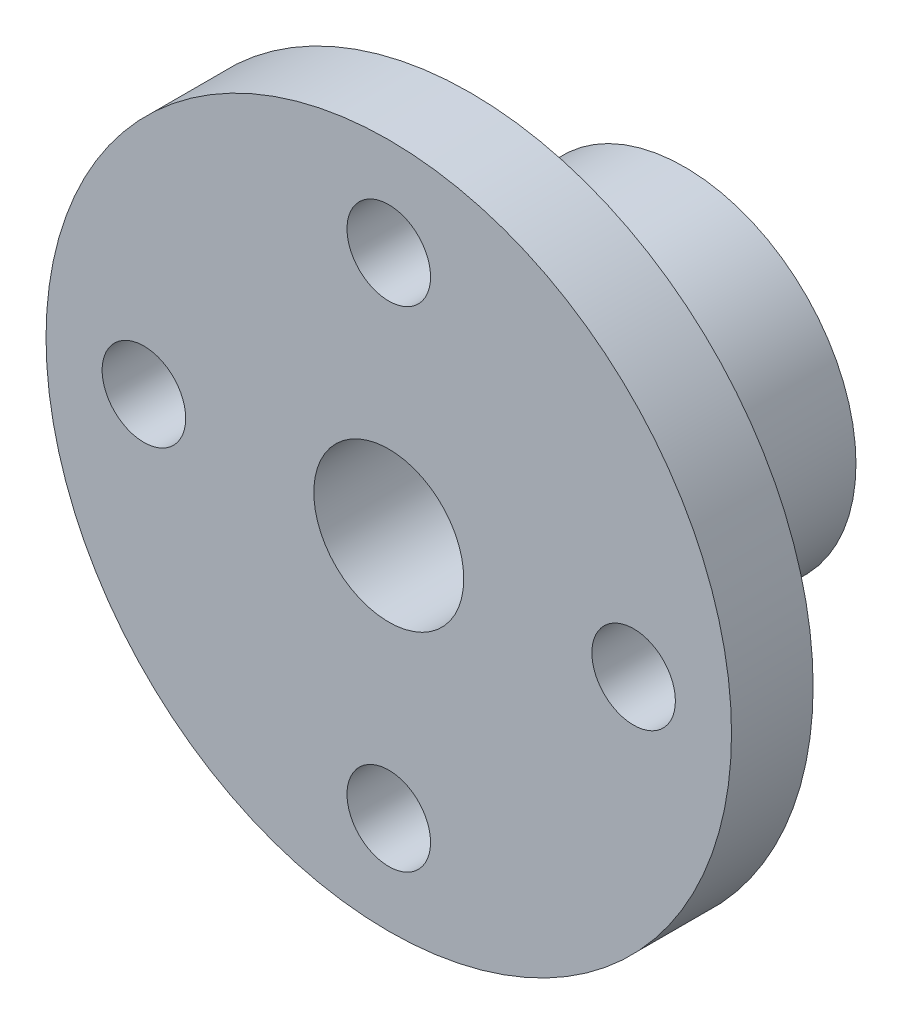
ISO-10303-21;
HEADER;
FILE_DESCRIPTION(('STEP AP214'),'2;1');
FILE_NAME('part.step','',(''),(''),'','','');
FILE_SCHEMA(('AUTOMOTIVE_DESIGN { 1 0 10303 214 1 1 1 1 }'));
ENDSEC;
DATA;
#1=APPLICATION_CONTEXT('core data for automotive mechanical design processes');
#2=APPLICATION_PROTOCOL_DEFINITION('international standard','automotive_design',2000,#1);
#3=PRODUCT_CONTEXT('',#1,'mechanical');
#4=PRODUCT('Part','Part','',(#3));
#5=PRODUCT_RELATED_PRODUCT_CATEGORY('part','',(#4));
#6=PRODUCT_DEFINITION_FORMATION('','',#4);
#7=PRODUCT_DEFINITION_CONTEXT('part definition',#1,'design');
#8=PRODUCT_DEFINITION('design','',#6,#7);
#9=PRODUCT_DEFINITION_SHAPE('','',#8);
#10=(LENGTH_UNIT() NAMED_UNIT(*) SI_UNIT(.MILLI.,.METRE.));
#11=(NAMED_UNIT(*) PLANE_ANGLE_UNIT() SI_UNIT($,.RADIAN.));
#12=(NAMED_UNIT(*) SI_UNIT($,.STERADIAN.) SOLID_ANGLE_UNIT());
#13=UNCERTAINTY_MEASURE_WITH_UNIT(LENGTH_MEASURE(1.E-05),#10,'distance_accuracy_value','');
#14=(GEOMETRIC_REPRESENTATION_CONTEXT(3) GLOBAL_UNCERTAINTY_ASSIGNED_CONTEXT((#13)) GLOBAL_UNIT_ASSIGNED_CONTEXT((#10,
#11,#12)) REPRESENTATION_CONTEXT('',''));
#15=CARTESIAN_POINT('',(0.,0.,0.));
#16=DIRECTION('',(0.,0.,1.));
#17=DIRECTION('',(1.,0.,0.));
#18=AXIS2_PLACEMENT_3D('',#15,#16,#17);
#19=CARTESIAN_POINT('',(0.,0.,0.));
#20=DIRECTION('',(0.,0.,1.));
#21=DIRECTION('',(1.,0.,0.));
#22=AXIS2_PLACEMENT_3D('',#19,#20,#21);
#23=PLANE('',#22);
#24=CARTESIAN_POINT('',(0.,0.,0.));
#25=DIRECTION('',(0.,0.,1.));
#26=DIRECTION('',(1.,0.,0.));
#27=AXIS2_PLACEMENT_3D('',#24,#25,#26);
#28=CIRCLE('',#27,8.);
#29=CARTESIAN_POINT('',(8.,0.,0.));
#30=VERTEX_POINT('',#29);
#31=EDGE_CURVE('E56',#30,#30,#28,.T.);
#32=ORIENTED_EDGE('',*,*,#31,.F.);
#33=EDGE_LOOP('',(#32));
#34=FACE_BOUND('',#33,.T.);
#35=CARTESIAN_POINT('',(0.,0.,0.));
#36=DIRECTION('',(0.,0.,1.));
#37=DIRECTION('',(1.,0.,0.));
#38=AXIS2_PLACEMENT_3D('',#35,#36,#37);
#39=CIRCLE('',#38,3.5);
#40=CARTESIAN_POINT('',(3.5,0.,0.));
#41=VERTEX_POINT('',#40);
#42=EDGE_CURVE('E62',#41,#41,#39,.T.);
#43=ORIENTED_EDGE('',*,*,#42,.T.);
#44=EDGE_LOOP('',(#43));
#45=FACE_BOUND('',#44,.T.);
#46=ADVANCED_FACE('F41',(#34,#45),#23,.F.);
#47=CARTESIAN_POINT('',(0.,0.,10.));
#48=DIRECTION('',(0.,0.,-1.));
#49=DIRECTION('',(-1.,0.,0.));
#50=AXIS2_PLACEMENT_3D('',#47,#48,#49);
#51=CYLINDRICAL_SURFACE('',#50,8.);
#52=CARTESIAN_POINT('',(0.,-8.,7.));
#53=CARTESIAN_POINT('',(0.110501451559641,-7.9999981315735,6.99999689901579));
#54=CARTESIAN_POINT('',(0.221037543774351,-7.99768770842435,6.99081126563495));
#55=CARTESIAN_POINT('',(0.438941765027377,-7.98869485106526,6.95436646492399));
#56=CARTESIAN_POINT('',(0.546308062494319,-7.98200993893301,6.92709705394953));
#57=CARTESIAN_POINT('',(0.754694496243435,-7.96500835109376,6.85541432871722));
#58=CARTESIAN_POINT('',(0.855722084573335,-7.95469603789411,6.81102160171297));
#59=CARTESIAN_POINT('',(1.04889617587257,-7.93153791743495,6.70642481327354));
#60=CARTESIAN_POINT('',(1.14104237913168,-7.91869202472209,6.64622021850804));
#61=CARTESIAN_POINT('',(1.31573590306789,-7.89156551455591,6.51039894712776));
#62=CARTESIAN_POINT('',(1.39807425341474,-7.87726276197502,6.43451790005459));
#63=CARTESIAN_POINT('',(1.54899856960443,-7.84898160157248,6.27006372678795));
#64=CARTESIAN_POINT('',(1.61758298259892,-7.83500323053157,6.18148916940409));
#65=CARTESIAN_POINT('',(1.74003539039863,-7.80873034264225,5.99253969768401));
#66=CARTESIAN_POINT('',(1.79366962123352,-7.79646392619748,5.89200902558836));
#67=CARTESIAN_POINT('',(1.88319587806766,-7.77532659757355,5.68300211778662));
#68=CARTESIAN_POINT('',(1.91909074058685,-7.76645514259225,5.57452715555731));
#69=CARTESIAN_POINT('',(1.97140644907302,-7.7533396892843,5.35500866906445));
#70=CARTESIAN_POINT('',(1.98820302444274,-7.74900654662681,5.24406013861601));
#71=CARTESIAN_POINT('',(2.00301570008854,-7.74519149946122,5.02084190800087));
#72=CARTESIAN_POINT('',(2.00103485575748,-7.74570880570571,4.90857242574382));
#73=CARTESIAN_POINT('',(1.97864869951961,-7.75145607355756,4.6887789230062));
#74=CARTESIAN_POINT('',(1.95869112025418,-7.75657150676391,4.58120583804623));
#75=CARTESIAN_POINT('',(1.90163224920399,-7.77075612894758,4.37098526545192));
#76=CARTESIAN_POINT('',(1.86452973609252,-7.77982559958985,4.26833812929477));
#77=CARTESIAN_POINT('',(1.77385263724958,-7.80100151874212,4.06968264499716));
#78=CARTESIAN_POINT('',(1.72011555631056,-7.81313769959755,3.97375177094724));
#79=CARTESIAN_POINT('',(1.59780836801993,-7.83906281127988,3.79210838699091));
#80=CARTESIAN_POINT('',(1.52923566507845,-7.85285203112837,3.70639766924367));
#81=CARTESIAN_POINT('',(1.37688456624163,-7.88101174053188,3.54506184574079));
#82=CARTESIAN_POINT('',(1.29272834422115,-7.89538759304001,3.46979401325153));
#83=CARTESIAN_POINT('',(1.11281589000493,-7.92274620771675,3.3343716767148));
#84=CARTESIAN_POINT('',(1.01705930361059,-7.93572892732543,3.27421763431525));
#85=CARTESIAN_POINT('',(0.816154518241856,-7.9589030945892,3.17059921836749));
#86=CARTESIAN_POINT('',(0.710975190944832,-7.96908480170303,3.12719287966076));
#87=CARTESIAN_POINT('',(0.494501344190511,-7.98543889321888,3.05877692572057));
#88=CARTESIAN_POINT('',(0.383207998867313,-7.99161204452374,3.03376379144248));
#89=CARTESIAN_POINT('',(0.160719960520036,-7.999139990285,3.00338991258822));
#90=CARTESIAN_POINT('',(0.0495956266509472,-8.00061404677705,2.9975426318996));
#91=CARTESIAN_POINT('',(-0.172043833068677,-7.99891739752601,3.00433200274065));
#92=CARTESIAN_POINT('',(-0.282559012859459,-7.99574710989128,3.01696699039884));
#93=CARTESIAN_POINT('',(-0.498152358368655,-7.98519441503143,3.05996121118851));
#94=CARTESIAN_POINT('',(-0.603286825291672,-7.97787512247748,3.09005501796932));
#95=CARTESIAN_POINT('',(-0.807009723270015,-7.95984942178845,3.16680944537126));
#96=CARTESIAN_POINT('',(-0.905597492043513,-7.94914267159856,3.21347173908423));
#97=CARTESIAN_POINT('',(-1.0953641792398,-7.92524410568414,3.3229815051663));
#98=CARTESIAN_POINT('',(-1.18638058911444,-7.91201156489243,3.38610148319568));
#99=CARTESIAN_POINT('',(-1.35670215152433,-7.88459345583226,3.52638654506263));
#100=CARTESIAN_POINT('',(-1.43600527863068,-7.87040772335606,3.60355405282254));
#101=CARTESIAN_POINT('',(-1.58265409076364,-7.84225275947695,3.77200261445929));
#102=CARTESIAN_POINT('',(-1.64965849016271,-7.82829738916375,3.86358360400323));
#103=CARTESIAN_POINT('',(-1.7673476786836,-7.80257171169652,4.05697684595429));
#104=CARTESIAN_POINT('',(-1.81803319221058,-7.79080130756035,4.15878864394634));
#105=CARTESIAN_POINT('',(-1.90126856081239,-7.77090792979554,4.3692076298841));
#106=CARTESIAN_POINT('',(-1.93392586220542,-7.76276340389208,4.47777017112535));
#107=CARTESIAN_POINT('',(-1.98046087993837,-7.75102325453578,4.69907951718548));
#108=CARTESIAN_POINT('',(-1.99434270330488,-7.74742663626581,4.81182540137665));
#109=CARTESIAN_POINT('',(-2.00271812044533,-7.74526534938609,5.03482803180694));
#110=CARTESIAN_POINT('',(-1.99775719704016,-7.74655910304351,5.14506324683297));
#111=CARTESIAN_POINT('',(-1.96983637108382,-7.7537054534379,5.36307185155731));
#112=CARTESIAN_POINT('',(-1.94687683024903,-7.75955795855809,5.47084529068487));
#113=CARTESIAN_POINT('',(-1.88390842592373,-7.77508347576963,5.68027794542054));
#114=CARTESIAN_POINT('',(-1.84400187290717,-7.78473353648412,5.78196974032028));
#115=CARTESIAN_POINT('',(-1.74835321814009,-7.80677007633105,5.97728717695158));
#116=CARTESIAN_POINT('',(-1.69260892004558,-7.81915693494364,6.07091169758255));
#117=CARTESIAN_POINT('',(-1.56515699818285,-7.84567512351349,6.25007283866936));
#118=CARTESIAN_POINT('',(-1.49307088388301,-7.85984353109009,6.33533476456528));
#119=CARTESIAN_POINT('',(-1.33571916158631,-7.88810702995047,6.49272939306054));
#120=CARTESIAN_POINT('',(-1.25045042834819,-7.90220210302746,6.56485897348396));
#121=CARTESIAN_POINT('',(-1.06729011560345,-7.92903540863551,6.69521507808614));
#122=CARTESIAN_POINT('',(-0.969197896421848,-7.94174444487824,6.75316615156211));
#123=CARTESIAN_POINT('',(-0.764354746013968,-7.96406566633491,6.85166328392071));
#124=CARTESIAN_POINT('',(-0.657610084582319,-7.97368006933042,6.89222181419805));
#125=CARTESIAN_POINT('',(-0.459213670991295,-7.98730746087389,6.94876244043954));
#126=CARTESIAN_POINT('',(-0.368506894544091,-7.9920344673692,6.96793499073791));
#127=CARTESIAN_POINT('',(-0.18520809538171,-7.99838140309264,6.99355459149592));
#128=CARTESIAN_POINT('',(-0.0926162149901548,-8.00000156601192,7.00000259907373));
#129=CARTESIAN_POINT('',(0.,-8.,7.));
#130=B_SPLINE_CURVE_WITH_KNOTS('',3,(#52,#53,#54,#55,#56,#57,#58,#59,#60,#61,#62,#63,#64,#65,
#66,#67,#68,#69,#70,#71,#72,#73,#74,#75,#76,#77,#78,#79,#80,#81,#82,#83,#84,#85,#86,#87,#88,#89,
#90,#91,#92,#93,#94,#95,#96,#97,#98,#99,#100,#101,#102,#103,#104,#105,#106,#107,#108,#109,#110,
#111,#112,#113,#114,#115,#116,#117,#118,#119,#120,#121,#122,#123,#124,#125,#126,#127,#128,#129),
.UNSPECIFIED.,.T.,.F.,(4,2,2,2,2,2,2,2,2,2,2,2,2,2,2,2,2,2,2,2,2,2,2,2,2,2,2,2,2,2,2,2,2,2,2,2,
2,2,4),(0.,0.331164949962519,0.662517650351866,0.99347320304814,1.32443992022577,
1.66152580582852,1.99864972773416,2.34078196727742,2.68285948225824,3.01808393468093,
3.3532538415469,3.68029996013785,4.00736937959145,4.337740371696,4.66816921119311,
5.00802001296453,5.34788119415424,5.6889097201658,6.02987298255951,6.36211078603462,
6.69431868154751,7.02160366023144,7.34892169767481,7.68204783424897,8.01523150681786,
8.35659345610395,8.69794025003772,9.03723006156476,9.37644564340971,9.70591707202578,
10.0353818794581,10.3628853408369,10.6904342418696,11.0265276855097,11.3627009303165,
11.7049624733721,12.0469781843289,12.3245632392729,12.6021274139515),.UNSPECIFIED.);
#131=CARTESIAN_POINT('',(0.,-8.,7.));
#132=VERTEX_POINT('',#131);
#133=EDGE_CURVE('E243',#132,#132,#130,.T.);
#134=ORIENTED_EDGE('',*,*,#133,.T.);
#135=EDGE_LOOP('',(#134));
#136=FACE_BOUND('',#135,.T.);
#137=CARTESIAN_POINT('',(0.,0.,10.));
#138=DIRECTION('',(0.,0.,1.));
#139=DIRECTION('',(1.,0.,0.));
#140=AXIS2_PLACEMENT_3D('',#137,#138,#139);
#141=CIRCLE('',#140,8.);
#142=CARTESIAN_POINT('',(8.,0.,10.));
#143=VERTEX_POINT('',#142);
#144=EDGE_CURVE('E10',#143,#143,#141,.T.);
#145=ORIENTED_EDGE('',*,*,#144,.F.);
#146=EDGE_LOOP('',(#145));
#147=FACE_BOUND('',#146,.T.);
#148=ORIENTED_EDGE('',*,*,#31,.T.);
#149=EDGE_LOOP('',(#148));
#150=FACE_BOUND('',#149,.T.);
#151=ADVANCED_FACE('F43',(#136,#147,#150),#51,.T.);
#152=CARTESIAN_POINT('',(0.,0.,10.));
#153=DIRECTION('',(0.,0.,-1.));
#154=DIRECTION('',(-1.,0.,0.));
#155=AXIS2_PLACEMENT_3D('',#152,#153,#154);
#156=CYLINDRICAL_SURFACE('',#155,3.5);
#157=CARTESIAN_POINT('',(0.,-3.5,7.));
#158=CARTESIAN_POINT('',(0.103121073276095,-3.49999553497163,6.99999502725213));
#159=CARTESIAN_POINT('',(0.206418292241573,-3.49539218804252,6.99196945368553));
#160=CARTESIAN_POINT('',(0.409938220573779,-3.47741964792396,6.96025838229543));
#161=CARTESIAN_POINT('',(0.510152306170788,-3.46402785992758,6.93653251819956));
#162=CARTESIAN_POINT('',(0.704136692781992,-3.42984640883029,6.87470120206554));
#163=CARTESIAN_POINT('',(0.79793516993675,-3.40909195395481,6.83666413455008));
#164=CARTESIAN_POINT('',(0.977566018148809,-3.36199330055898,6.74769013430304));
#165=CARTESIAN_POINT('',(1.06340059975113,-3.33565065986803,6.69675679592544));
#166=CARTESIAN_POINT('',(1.23168334606477,-3.27741428654611,6.57931420254712));
#167=CARTESIAN_POINT('',(1.31343890348909,-3.24525701136939,6.51194552690006));
#168=CARTESIAN_POINT('',(1.46516457042854,-3.17964476042357,6.36544265813628));
#169=CARTESIAN_POINT('',(1.53512065191323,-3.1461882973923,6.28629466837634));
#170=CARTESIAN_POINT('',(1.66894420512512,-3.07747838735578,6.10830358077026));
#171=CARTESIAN_POINT('',(1.73132377325174,-3.04242478885631,6.00825487214969));
#172=CARTESIAN_POINT('',(1.83811251873574,-2.9791301999857,5.79704972790448));
#173=CARTESIAN_POINT('',(1.88254890095162,-2.9508789226201,5.68591042899068));
#174=CARTESIAN_POINT('',(1.94359344806483,-2.9109223878371,5.48085483564781));
#175=CARTESIAN_POINT('',(1.96418339921187,-2.89693925602986,5.38856848582508));
#176=CARTESIAN_POINT('',(1.99210676207498,-2.87781339076578,5.20115026430666));
#177=CARTESIAN_POINT('',(1.99945438414142,-2.87266118113285,5.10602155436301));
#178=CARTESIAN_POINT('',(2.00048758468052,-2.87194187276704,4.91552531469126));
#179=CARTESIAN_POINT('',(1.99415450528781,-2.87638786414303,4.82015763621347));
#180=CARTESIAN_POINT('',(1.96816496378147,-2.89422946937727,4.63209749481326));
#181=CARTESIAN_POINT('',(1.94849933463808,-2.90763124084925,4.53940691832707));
#182=CARTESIAN_POINT('',(1.8969175277205,-2.94153701353578,4.35933506968057));
#183=CARTESIAN_POINT('',(1.86504898450024,-2.9620133688412,4.27193466450099));
#184=CARTESIAN_POINT('',(1.79016995537344,-3.00785886649625,4.10345014732228));
#185=CARTESIAN_POINT('',(1.74715520649775,-3.03322987990244,4.02236846744482));
#186=CARTESIAN_POINT('',(1.64323768381765,-3.09092813712121,3.8550271046303));
#187=CARTESIAN_POINT('',(1.5805729697491,-3.12371858601075,3.77001985827188));
#188=CARTESIAN_POINT('',(1.44275323922578,-3.18971935679179,3.61091568049858));
#189=CARTESIAN_POINT('',(1.3675875758611,-3.22293001410094,3.53682815160806));
#190=CARTESIAN_POINT('',(1.19664071603844,-3.29050445602272,3.39317579858664));
#191=CARTESIAN_POINT('',(1.0994865853507,-3.32456879734034,3.32508704888204));
#192=CARTESIAN_POINT('',(0.893015490655647,-3.38586602556589,3.20649320854487));
#193=CARTESIAN_POINT('',(0.783706249477136,-3.41310321475137,3.1559770363486));
#194=CARTESIAN_POINT('',(0.56379377817917,-3.45598032097163,3.07781607577408));
#195=CARTESIAN_POINT('',(0.453802193453647,-3.47229170031822,3.04883178938481));
#196=CARTESIAN_POINT('',(0.229493069556977,-3.49427902499676,3.00996184112122));
#197=CARTESIAN_POINT('',(0.115179910205494,-3.49996545850225,3.0000573447666));
#198=CARTESIAN_POINT('',(-0.099523459313444,-3.50003013582766,2.99994998886615));
#199=CARTESIAN_POINT('',(-0.199920938989512,-3.49569611836472,3.00750353381573));
#200=CARTESIAN_POINT('',(-0.39775495897108,-3.47874174583056,3.03740057339513));
#201=CARTESIAN_POINT('',(-0.495191448486275,-3.46612124870397,3.05974432157391));
#202=CARTESIAN_POINT('',(-0.683570804723374,-3.43391644887745,3.11788463846708));
#203=CARTESIAN_POINT('',(-0.774570013012139,-3.41440488141579,3.15354090994096));
#204=CARTESIAN_POINT('',(-0.949355356164682,-3.36999496877882,3.23701573604713));
#205=CARTESIAN_POINT('',(-1.03313974782513,-3.34509532684397,3.28483721899456));
#206=CARTESIAN_POINT('',(-1.20050997117732,-3.28897467991618,3.39689384085787));
#207=CARTESIAN_POINT('',(-1.28316737085611,-3.25736546620182,3.4623193381627));
#208=CARTESIAN_POINT('',(-1.43697220197863,-3.19250590835506,3.6049616611228));
#209=CARTESIAN_POINT('',(-1.50810627029584,-3.15925371640031,3.68219197754095));
#210=CARTESIAN_POINT('',(-1.64492727997191,-3.09042173562361,3.85640252380876));
#211=CARTESIAN_POINT('',(-1.70912186715334,-3.05499597284182,3.9546247985922));
#212=CARTESIAN_POINT('',(-1.8199337629672,-2.99031347421968,4.16235463141538));
#213=CARTESIAN_POINT('',(-1.86657443137411,-2.96104856289278,4.27184694289746));
#214=CARTESIAN_POINT('',(-1.93222109228879,-2.91851233429598,4.4752352640087));
#215=CARTESIAN_POINT('',(-1.95499953445203,-2.90316105554951,4.56747649103178));
#216=CARTESIAN_POINT('',(-1.98724336712396,-2.88119032331328,4.75523409234326));
#217=CARTESIAN_POINT('',(-1.99672390601701,-2.87456093476639,4.85074661279577));
#218=CARTESIAN_POINT('',(-2.00185191685029,-2.87099312033822,5.04252276986693));
#219=CARTESIAN_POINT('',(-1.99747153858607,-2.87407420528575,5.13878753054577));
#220=CARTESIAN_POINT('',(-1.97508383758896,-2.8895014010665,5.32897715069236));
#221=CARTESIAN_POINT('',(-1.95706789608754,-2.90185337180125,5.42290049139406));
#222=CARTESIAN_POINT('',(-1.90877044170586,-2.93383807739165,5.60437563303356));
#223=CARTESIAN_POINT('',(-1.87870654392502,-2.95334114102881,5.69200955824919));
#224=CARTESIAN_POINT('',(-1.8074218972167,-2.99749553285303,5.86119909574359));
#225=CARTESIAN_POINT('',(-1.7661970341072,-3.02214875873851,5.94275245242157));
#226=CARTESIAN_POINT('',(-1.66643167949608,-3.07843523089261,6.11084333294311));
#227=CARTESIAN_POINT('',(-1.60620233461966,-3.11055873295866,6.19621458045877));
#228=CARTESIAN_POINT('',(-1.47338604433882,-3.17562734730331,6.35645763372194));
#229=CARTESIAN_POINT('',(-1.40078837818174,-3.20857315102009,6.43132022710409));
#230=CARTESIAN_POINT('',(-1.23454792336607,-3.27641810201075,6.57786072312091));
#231=CARTESIAN_POINT('',(-1.13941038595581,-3.31104995544659,6.64798238220285));
#232=CARTESIAN_POINT('',(-0.93668149876144,-3.37399623220539,6.77105878863118));
#233=CARTESIAN_POINT('',(-0.829097167751355,-3.4023141898287,6.82402314759852));
#234=CARTESIAN_POINT('',(-0.62438250119415,-3.44515268687731,6.90261714413287));
#235=CARTESIAN_POINT('',(-0.528793868969384,-3.46123111271098,6.93143235098222));
#236=CARTESIAN_POINT('',(-0.333572465521446,-3.48544612424225,6.97450218307986));
#237=CARTESIAN_POINT('',(-0.233952251382032,-3.49360564902775,6.98879887048321));
#238=CARTESIAN_POINT('',(-0.111553482810458,-3.49829363663156,6.99701217642184));
#239=CARTESIAN_POINT('',(-0.0892655426398963,-3.49893257713488,6.99813153012492));
#240=CARTESIAN_POINT('',(-0.0446544907868009,-3.49978626453079,6.99962601938614));
#241=CARTESIAN_POINT('',(-0.0223313756604228,-3.50000096692386,7.00000107687301));
#242=CARTESIAN_POINT('',(0.,-3.5,7.));
#243=B_SPLINE_CURVE_WITH_KNOTS('',3,(#157,#158,#159,#160,#161,#162,#163,#164,#165,#166,#167,
#168,#169,#170,#171,#172,#173,#174,#175,#176,#177,#178,#179,#180,#181,#182,#183,#184,#185,#186,
#187,#188,#189,#190,#191,#192,#193,#194,#195,#196,#197,#198,#199,#200,#201,#202,#203,#204,#205,
#206,#207,#208,#209,#210,#211,#212,#213,#214,#215,#216,#217,#218,#219,#220,#221,#222,#223,#224,
#225,#226,#227,#228,#229,#230,#231,#232,#233,#234,#235,#236,#237,#238,#239,#240,#241,#242),
.UNSPECIFIED.,.T.,.F.,(4,2,2,2,2,2,2,2,2,2,2,2,2,2,2,2,2,2,2,2,2,2,2,2,2,2,2,2,2,2,2,2,2,2,2,2,
2,2,2,2,2,2,4),(0.,0.309268603260588,0.619335457908361,0.9279391304917,1.23645688582088,
1.56726264134176,1.89845895106408,2.2656484043951,2.63227902790326,2.91779157032785,
3.2029975462506,3.48859273422686,3.77438448762791,4.05907183070886,4.34386821620899,
4.67430361887065,5.00502190433096,5.37340568410987,5.74155673192308,6.08426181113763,
6.42662841774189,6.72747548140297,7.028327702629,7.32609492686909,7.62393389525626,
7.95277463151787,8.28199402221959,8.64793130772769,9.01337988790352,9.30087929443284,
9.58805092761004,9.87579992974731,10.1637309643623,10.4466801504154,10.7297337802306,
11.0563737137124,11.3832982298872,11.7509152703937,12.1183260120783,12.4204193511693,
12.7216349655948,12.7886015789519,12.85557521625),.UNSPECIFIED.);
#244=CARTESIAN_POINT('',(0.,-3.5,7.));
#245=VERTEX_POINT('',#244);
#246=EDGE_CURVE('E46',#245,#245,#243,.T.);
#247=ORIENTED_EDGE('',*,*,#246,.F.);
#248=EDGE_LOOP('',(#247));
#249=FACE_BOUND('',#248,.T.);
#250=ORIENTED_EDGE('',*,*,#42,.F.);
#251=EDGE_LOOP('',(#250));
#252=FACE_BOUND('',#251,.T.);
#253=CARTESIAN_POINT('',(0.,0.,13.81));
#254=DIRECTION('',(0.,0.,1.));
#255=DIRECTION('',(1.,0.,0.));
#256=AXIS2_PLACEMENT_3D('',#253,#254,#255);
#257=CIRCLE('',#256,3.5);
#258=CARTESIAN_POINT('',(3.5,0.,13.81));
#259=VERTEX_POINT('',#258);
#260=EDGE_CURVE('E82',#259,#259,#257,.T.);
#261=ORIENTED_EDGE('',*,*,#260,.T.);
#262=EDGE_LOOP('',(#261));
#263=FACE_BOUND('',#262,.T.);
#264=ADVANCED_FACE('F107',(#249,#252,#263),#156,.F.);
#265=CARTESIAN_POINT('',(0.,0.,13.81));
#266=DIRECTION('',(0.,0.,1.));
#267=DIRECTION('',(1.,0.,0.));
#268=AXIS2_PLACEMENT_3D('',#265,#266,#267);
#269=PLANE('',#268);
#270=CARTESIAN_POINT('',(0.,11.43,13.81));
#271=DIRECTION('',(0.,0.,1.));
#272=DIRECTION('',(1.,0.,0.));
#273=AXIS2_PLACEMENT_3D('',#270,#271,#272);
#274=CIRCLE('',#273,1.95);
#275=CARTESIAN_POINT('',(1.95,11.43,13.81));
#276=VERTEX_POINT('',#275);
#277=EDGE_CURVE('E72',#276,#276,#274,.T.);
#278=ORIENTED_EDGE('',*,*,#277,.F.);
#279=EDGE_LOOP('',(#278));
#280=FACE_BOUND('',#279,.T.);
#281=CARTESIAN_POINT('',(11.4300000000003,2.8697597116275E-13,13.81));
#282=DIRECTION('',(0.,0.,1.));
#283=DIRECTION('',(1.,0.,0.));
#284=AXIS2_PLACEMENT_3D('',#281,#282,#283);
#285=CIRCLE('',#284,1.95);
#286=CARTESIAN_POINT('',(13.3800000000003,2.8697597116275E-13,13.81));
#287=VERTEX_POINT('',#286);
#288=EDGE_CURVE('E253',#287,#287,#285,.T.);
#289=ORIENTED_EDGE('',*,*,#288,.F.);
#290=EDGE_LOOP('',(#289));
#291=FACE_BOUND('',#290,.T.);
#292=CARTESIAN_POINT('',(5.739519423255E-13,-11.43,13.81));
#293=DIRECTION('',(0.,0.,1.));
#294=DIRECTION('',(1.,0.,0.));
#295=AXIS2_PLACEMENT_3D('',#292,#293,#294);
#296=CIRCLE('',#295,1.95);
#297=CARTESIAN_POINT('',(1.95000000000057,-11.43,13.81));
#298=VERTEX_POINT('',#297);
#299=EDGE_CURVE('E256',#298,#298,#296,.T.);
#300=ORIENTED_EDGE('',*,*,#299,.F.);
#301=EDGE_LOOP('',(#300));
#302=FACE_BOUND('',#301,.T.);
#303=CARTESIAN_POINT('',(-11.4299999999997,-2.88375742454175E-13,13.81));
#304=DIRECTION('',(0.,0.,1.));
#305=DIRECTION('',(1.,0.,0.));
#306=AXIS2_PLACEMENT_3D('',#303,#304,#305);
#307=CIRCLE('',#306,1.95);
#308=CARTESIAN_POINT('',(-9.47999999999971,-2.88375742454175E-13,13.81));
#309=VERTEX_POINT('',#308);
#310=EDGE_CURVE('E96',#309,#309,#307,.T.);
#311=ORIENTED_EDGE('',*,*,#310,.F.);
#312=EDGE_LOOP('',(#311));
#313=FACE_BOUND('',#312,.T.);
#314=CARTESIAN_POINT('',(0.,0.,13.81));
#315=DIRECTION('',(0.,0.,1.));
#316=DIRECTION('',(1.,0.,0.));
#317=AXIS2_PLACEMENT_3D('',#314,#315,#316);
#318=CIRCLE('',#317,16.);
#319=CARTESIAN_POINT('',(-16.,0.,13.81));
#320=VERTEX_POINT('',#319);
#321=EDGE_CURVE('E93',#320,#320,#318,.T.);
#322=ORIENTED_EDGE('',*,*,#321,.T.);
#323=EDGE_LOOP('',(#322));
#324=FACE_BOUND('',#323,.T.);
#325=ORIENTED_EDGE('',*,*,#260,.F.);
#326=EDGE_LOOP('',(#325));
#327=FACE_BOUND('',#326,.T.);
#328=ADVANCED_FACE('F109',(#280,#291,#302,#313,#324,#327),#269,.T.);
#329=CARTESIAN_POINT('',(0.,0.,10.));
#330=DIRECTION('',(0.,0.,1.));
#331=DIRECTION('',(1.,0.,0.));
#332=AXIS2_PLACEMENT_3D('',#329,#330,#331);
#333=PLANE('',#332);
#334=CARTESIAN_POINT('',(0.,11.43,10.));
#335=DIRECTION('',(0.,0.,1.));
#336=DIRECTION('',(1.,0.,0.));
#337=AXIS2_PLACEMENT_3D('',#334,#335,#336);
#338=CIRCLE('',#337,1.95);
#339=CARTESIAN_POINT('',(1.95,11.43,10.));
#340=VERTEX_POINT('',#339);
#341=EDGE_CURVE('E79',#340,#340,#338,.T.);
#342=ORIENTED_EDGE('',*,*,#341,.T.);
#343=EDGE_LOOP('',(#342));
#344=FACE_BOUND('',#343,.T.);
#345=CARTESIAN_POINT('',(11.4300000000003,2.8697597116275E-13,10.));
#346=DIRECTION('',(0.,0.,1.));
#347=DIRECTION('',(1.,0.,0.));
#348=AXIS2_PLACEMENT_3D('',#345,#346,#347);
#349=CIRCLE('',#348,1.95);
#350=CARTESIAN_POINT('',(13.3800000000003,2.8697597116275E-13,10.));
#351=VERTEX_POINT('',#350);
#352=EDGE_CURVE('E76',#351,#351,#349,.T.);
#353=ORIENTED_EDGE('',*,*,#352,.T.);
#354=EDGE_LOOP('',(#353));
#355=FACE_BOUND('',#354,.T.);
#356=CARTESIAN_POINT('',(5.739519423255E-13,-11.43,10.));
#357=DIRECTION('',(0.,0.,1.));
#358=DIRECTION('',(1.,0.,0.));
#359=AXIS2_PLACEMENT_3D('',#356,#357,#358);
#360=CIRCLE('',#359,1.95);
#361=CARTESIAN_POINT('',(1.95000000000057,-11.43,10.));
#362=VERTEX_POINT('',#361);
#363=EDGE_CURVE('E71',#362,#362,#360,.T.);
#364=ORIENTED_EDGE('',*,*,#363,.T.);
#365=EDGE_LOOP('',(#364));
#366=FACE_BOUND('',#365,.T.);
#367=CARTESIAN_POINT('',(-11.4299999999997,-2.88375742454175E-13,10.));
#368=DIRECTION('',(0.,0.,1.));
#369=DIRECTION('',(1.,0.,0.));
#370=AXIS2_PLACEMENT_3D('',#367,#368,#369);
#371=CIRCLE('',#370,1.95);
#372=CARTESIAN_POINT('',(-9.47999999999971,-2.88375742454175E-13,10.));
#373=VERTEX_POINT('',#372);
#374=EDGE_CURVE('E67',#373,#373,#371,.T.);
#375=ORIENTED_EDGE('',*,*,#374,.T.);
#376=EDGE_LOOP('',(#375));
#377=FACE_BOUND('',#376,.T.);
#378=ORIENTED_EDGE('',*,*,#144,.T.);
#379=EDGE_LOOP('',(#378));
#380=FACE_BOUND('',#379,.T.);
#381=CARTESIAN_POINT('',(0.,0.,10.));
#382=DIRECTION('',(0.,0.,1.));
#383=DIRECTION('',(1.,0.,0.));
#384=AXIS2_PLACEMENT_3D('',#381,#382,#383);
#385=CIRCLE('',#384,16.);
#386=CARTESIAN_POINT('',(-16.,0.,10.));
#387=VERTEX_POINT('',#386);
#388=EDGE_CURVE('E87',#387,#387,#385,.T.);
#389=ORIENTED_EDGE('',*,*,#388,.F.);
#390=EDGE_LOOP('',(#389));
#391=FACE_BOUND('',#390,.T.);
#392=ADVANCED_FACE('F115',(#344,#355,#366,#377,#380,#391),#333,.F.);
#393=CARTESIAN_POINT('',(0.,0.,13.81));
#394=DIRECTION('',(0.,0.,-1.));
#395=DIRECTION('',(-1.,0.,0.));
#396=AXIS2_PLACEMENT_3D('',#393,#394,#395);
#397=CYLINDRICAL_SURFACE('',#396,16.);
#398=CARTESIAN_POINT('',(-16.,0.,13.81));
#399=CARTESIAN_POINT('',(-16.,0.,13.7703125));
#400=CARTESIAN_POINT('',(-16.,0.,13.730625));
#401=CARTESIAN_POINT('',(-16.,0.,13.65125));
#402=CARTESIAN_POINT('',(-16.,0.,13.6115625));
#403=CARTESIAN_POINT('',(-16.,0.,13.5321875));
#404=CARTESIAN_POINT('',(-16.,0.,13.4925));
#405=CARTESIAN_POINT('',(-16.,0.,13.413125));
#406=CARTESIAN_POINT('',(-16.,0.,13.3734375));
#407=CARTESIAN_POINT('',(-16.,0.,13.2940625));
#408=CARTESIAN_POINT('',(-16.,0.,13.254375));
#409=CARTESIAN_POINT('',(-16.,0.,13.175));
#410=CARTESIAN_POINT('',(-16.,0.,13.1353125));
#411=CARTESIAN_POINT('',(-16.,0.,13.0559375));
#412=CARTESIAN_POINT('',(-16.,0.,13.01625));
#413=CARTESIAN_POINT('',(-16.,0.,12.936875));
#414=CARTESIAN_POINT('',(-16.,0.,12.8971875));
#415=CARTESIAN_POINT('',(-16.,0.,12.8178125));
#416=CARTESIAN_POINT('',(-16.,0.,12.778125));
#417=CARTESIAN_POINT('',(-16.,0.,12.69875));
#418=CARTESIAN_POINT('',(-16.,0.,12.6590625));
#419=CARTESIAN_POINT('',(-16.,0.,12.5796875));
#420=CARTESIAN_POINT('',(-16.,0.,12.54));
#421=CARTESIAN_POINT('',(-16.,0.,12.460625));
#422=CARTESIAN_POINT('',(-16.,0.,12.4209375));
#423=CARTESIAN_POINT('',(-16.,0.,12.3415625));
#424=CARTESIAN_POINT('',(-16.,0.,12.301875));
#425=CARTESIAN_POINT('',(-16.,0.,12.2225));
#426=CARTESIAN_POINT('',(-16.,0.,12.1828125));
#427=CARTESIAN_POINT('',(-16.,0.,12.1034375));
#428=CARTESIAN_POINT('',(-16.,0.,12.06375));
#429=CARTESIAN_POINT('',(-16.,0.,11.984375));
#430=CARTESIAN_POINT('',(-16.,0.,11.9446875));
#431=CARTESIAN_POINT('',(-16.,0.,11.8653125));
#432=CARTESIAN_POINT('',(-16.,0.,11.825625));
#433=CARTESIAN_POINT('',(-16.,0.,11.74625));
#434=CARTESIAN_POINT('',(-16.,0.,11.7065625));
#435=CARTESIAN_POINT('',(-16.,0.,11.6271875));
#436=CARTESIAN_POINT('',(-16.,0.,11.5875));
#437=CARTESIAN_POINT('',(-16.,0.,11.508125));
#438=CARTESIAN_POINT('',(-16.,0.,11.4684375));
#439=CARTESIAN_POINT('',(-16.,0.,11.3890625));
#440=CARTESIAN_POINT('',(-16.,0.,11.349375));
#441=CARTESIAN_POINT('',(-16.,0.,11.27));
#442=CARTESIAN_POINT('',(-16.,0.,11.2303125));
#443=CARTESIAN_POINT('',(-16.,0.,11.1509375));
#444=CARTESIAN_POINT('',(-16.,0.,11.11125));
#445=CARTESIAN_POINT('',(-16.,0.,11.031875));
#446=CARTESIAN_POINT('',(-16.,0.,10.9921875));
#447=CARTESIAN_POINT('',(-16.,0.,10.9128125));
#448=CARTESIAN_POINT('',(-16.,0.,10.873125));
#449=CARTESIAN_POINT('',(-16.,0.,10.79375));
#450=CARTESIAN_POINT('',(-16.,0.,10.7540625));
#451=CARTESIAN_POINT('',(-16.,0.,10.6746875));
#452=CARTESIAN_POINT('',(-16.,0.,10.635));
#453=CARTESIAN_POINT('',(-16.,0.,10.555625));
#454=CARTESIAN_POINT('',(-16.,0.,10.5159375));
#455=CARTESIAN_POINT('',(-16.,0.,10.4365625));
#456=CARTESIAN_POINT('',(-16.,0.,10.396875));
#457=CARTESIAN_POINT('',(-16.,0.,10.3175));
#458=CARTESIAN_POINT('',(-16.,0.,10.2778125));
#459=CARTESIAN_POINT('',(-16.,0.,10.1984375));
#460=CARTESIAN_POINT('',(-16.,0.,10.15875));
#461=CARTESIAN_POINT('',(-16.,0.,10.079375));
#462=CARTESIAN_POINT('',(-16.,0.,10.0396875));
#463=CARTESIAN_POINT('',(-16.,0.,10.));
#464=B_SPLINE_CURVE_WITH_KNOTS('',3,(#398,#399,#400,#401,#402,#403,#404,#405,#406,#407,#408,
#409,#410,#411,#412,#413,#414,#415,#416,#417,#418,#419,#420,#421,#422,#423,#424,#425,#426,#427,
#428,#429,#430,#431,#432,#433,#434,#435,#436,#437,#438,#439,#440,#441,#442,#443,#444,#445,#446,
#447,#448,#449,#450,#451,#452,#453,#454,#455,#456,#457,#458,#459,#460,#461,#462,#463),
.UNSPECIFIED.,.F.,.F.,(4,2,2,2,2,2,2,2,2,2,2,2,2,2,2,2,2,2,2,2,2,2,2,2,2,2,2,2,2,2,2,2,4),(0.,
0.119062500000001,0.238125,0.357187500000002,0.476250000000001,0.5953125,0.714375,
0.833437500000001,0.9525,1.0715625,1.190625,1.3096875,1.42875,1.5478125,1.666875,1.7859375,
1.905,2.0240625,2.143125,2.2621875,2.38125,2.5003125,2.619375,2.7384375,2.8575,2.9765625,
3.095625,3.2146875,3.33375,3.4528125,3.571875,3.6909375,3.81),.UNSPECIFIED.);
#465=EDGE_CURVE('BSEAM183',#320,#387,#464,.T.);
#466=ORIENTED_EDGE('',*,*,#321,.F.);
#467=ORIENTED_EDGE('',*,*,#388,.T.);
#468=ORIENTED_EDGE('',*,*,#465,.T.);
#469=ORIENTED_EDGE('',*,*,#465,.F.);
#470=EDGE_LOOP('',(#466,#468,#467,#469));
#471=FACE_BOUND('',#470,.T.);
#472=ADVANCED_FACE('F183',(#471),#397,.T.);
#473=CARTESIAN_POINT('',(-11.4299999999997,-2.88375742454175E-13,0.));
#474=DIRECTION('',(0.,0.,1.));
#475=DIRECTION('',(1.,0.,0.));
#476=AXIS2_PLACEMENT_3D('',#473,#474,#475);
#477=CYLINDRICAL_SURFACE('',#476,1.95);
#478=ORIENTED_EDGE('',*,*,#310,.T.);
#479=EDGE_LOOP('',(#478));
#480=FACE_BOUND('',#479,.T.);
#481=ORIENTED_EDGE('',*,*,#374,.F.);
#482=EDGE_LOOP('',(#481));
#483=FACE_BOUND('',#482,.T.);
#484=ADVANCED_FACE('F175',(#480,#483),#477,.F.);
#485=CARTESIAN_POINT('',(5.739519423255E-13,-11.43,0.));
#486=DIRECTION('',(0.,0.,1.));
#487=DIRECTION('',(1.,0.,0.));
#488=AXIS2_PLACEMENT_3D('',#485,#486,#487);
#489=CYLINDRICAL_SURFACE('',#488,1.95);
#490=ORIENTED_EDGE('',*,*,#299,.T.);
#491=EDGE_LOOP('',(#490));
#492=FACE_BOUND('',#491,.T.);
#493=ORIENTED_EDGE('',*,*,#363,.F.);
#494=EDGE_LOOP('',(#493));
#495=FACE_BOUND('',#494,.T.);
#496=ADVANCED_FACE('F167',(#492,#495),#489,.F.);
#497=CARTESIAN_POINT('',(11.4300000000003,2.8697597116275E-13,0.));
#498=DIRECTION('',(0.,0.,1.));
#499=DIRECTION('',(1.,0.,0.));
#500=AXIS2_PLACEMENT_3D('',#497,#498,#499);
#501=CYLINDRICAL_SURFACE('',#500,1.95);
#502=ORIENTED_EDGE('',*,*,#288,.T.);
#503=EDGE_LOOP('',(#502));
#504=FACE_BOUND('',#503,.T.);
#505=ORIENTED_EDGE('',*,*,#352,.F.);
#506=EDGE_LOOP('',(#505));
#507=FACE_BOUND('',#506,.T.);
#508=ADVANCED_FACE('F162',(#504,#507),#501,.F.);
#509=CARTESIAN_POINT('',(0.,11.43,0.));
#510=DIRECTION('',(0.,0.,1.));
#511=DIRECTION('',(1.,0.,0.));
#512=AXIS2_PLACEMENT_3D('',#509,#510,#511);
#513=CYLINDRICAL_SURFACE('',#512,1.95);
#514=ORIENTED_EDGE('',*,*,#277,.T.);
#515=EDGE_LOOP('',(#514));
#516=FACE_BOUND('',#515,.T.);
#517=ORIENTED_EDGE('',*,*,#341,.F.);
#518=EDGE_LOOP('',(#517));
#519=FACE_BOUND('',#518,.T.);
#520=ADVANCED_FACE('F140',(#516,#519),#513,.F.);
#521=CARTESIAN_POINT('',(0.,-16.,5.));
#522=DIRECTION('',(0.,1.,0.));
#523=DIRECTION('',(0.,0.,1.));
#524=AXIS2_PLACEMENT_3D('',#521,#522,#523);
#525=CYLINDRICAL_SURFACE('',#524,2.);
#526=ORIENTED_EDGE('',*,*,#246,.T.);
#527=EDGE_LOOP('',(#526));
#528=FACE_BOUND('',#527,.T.);
#529=ORIENTED_EDGE('',*,*,#133,.F.);
#530=EDGE_LOOP('',(#529));
#531=FACE_BOUND('',#530,.T.);
#532=ADVANCED_FACE('F151',(#528,#531),#525,.F.);
#533=CLOSED_SHELL('',(#46,#151,#264,#328,#392,#472,#484,#496,#508,#520,#532));
#534=MANIFOLD_SOLID_BREP('B2',#533);
#535=ADVANCED_BREP_SHAPE_REPRESENTATION('',(#18,#534),#14);
#536=SHAPE_DEFINITION_REPRESENTATION(#9,#535);
ENDSEC;
END-ISO-10303-21;
